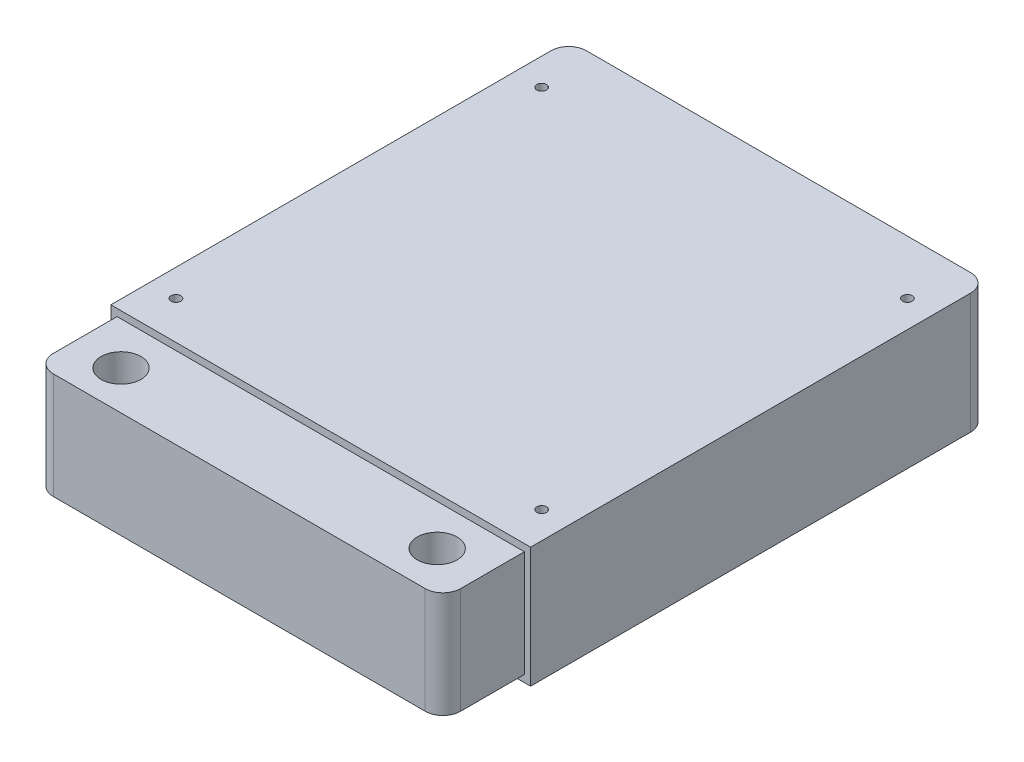
ISO-10303-21;
HEADER;
FILE_DESCRIPTION(('STEP AP214'),'2;1');
FILE_NAME('part.step','',(''),(''),'','','');
FILE_SCHEMA(('AUTOMOTIVE_DESIGN { 1 0 10303 214 1 1 1 1 }'));
ENDSEC;
DATA;
#1=APPLICATION_CONTEXT('core data for automotive mechanical design processes');
#2=APPLICATION_PROTOCOL_DEFINITION('international standard','automotive_design',2000,#1);
#3=PRODUCT_CONTEXT('',#1,'mechanical');
#4=PRODUCT('Part','Part','',(#3));
#5=PRODUCT_RELATED_PRODUCT_CATEGORY('part','',(#4));
#6=PRODUCT_DEFINITION_FORMATION('','',#4);
#7=PRODUCT_DEFINITION_CONTEXT('part definition',#1,'design');
#8=PRODUCT_DEFINITION('design','',#6,#7);
#9=PRODUCT_DEFINITION_SHAPE('','',#8);
#10=(LENGTH_UNIT() NAMED_UNIT(*) SI_UNIT(.MILLI.,.METRE.));
#11=(NAMED_UNIT(*) PLANE_ANGLE_UNIT() SI_UNIT($,.RADIAN.));
#12=(NAMED_UNIT(*) SI_UNIT($,.STERADIAN.) SOLID_ANGLE_UNIT());
#13=UNCERTAINTY_MEASURE_WITH_UNIT(LENGTH_MEASURE(1.E-05),#10,'distance_accuracy_value','');
#14=(GEOMETRIC_REPRESENTATION_CONTEXT(3) GLOBAL_UNCERTAINTY_ASSIGNED_CONTEXT((#13)) GLOBAL_UNIT_ASSIGNED_CONTEXT((#10,
#11,#12)) REPRESENTATION_CONTEXT('',''));
#15=CARTESIAN_POINT('',(0.,0.,0.));
#16=DIRECTION('',(0.,0.,1.));
#17=DIRECTION('',(1.,0.,0.));
#18=AXIS2_PLACEMENT_3D('',#15,#16,#17);
#19=CARTESIAN_POINT('',(-143.433647385571,34.544,12.0931673151752));
#20=DIRECTION('',(0.,0.,-1.));
#21=DIRECTION('',(-1.,0.,0.));
#22=AXIS2_PLACEMENT_3D('',#19,#20,#21);
#23=PLANE('',#22);
#24=DIRECTION('',(1.,0.,0.));
#25=VECTOR('',#24,1.);
#26=CARTESIAN_POINT('',(-143.433647385571,0.,12.0931673151752));
#27=LINE('',#26,#25);
#28=CARTESIAN_POINT('',(-143.433647385571,0.,12.0931673151752));
#29=VERTEX_POINT('',#28);
#30=CARTESIAN_POINT('',(-23.0376473855714,0.,12.0931673151752));
#31=VERTEX_POINT('',#30);
#32=EDGE_CURVE('E186',#29,#31,#27,.T.);
#33=ORIENTED_EDGE('',*,*,#32,.T.);
#34=DIRECTION('',(0.,-1.,0.));
#35=VECTOR('',#34,1.);
#36=CARTESIAN_POINT('',(-23.0376473855714,34.544,12.0931673151752));
#37=LINE('',#36,#35);
#38=CARTESIAN_POINT('',(-23.0376473855714,34.544,12.0931673151752));
#39=VERTEX_POINT('',#38);
#40=EDGE_CURVE('E193',#39,#31,#37,.T.);
#41=ORIENTED_EDGE('',*,*,#40,.F.);
#42=DIRECTION('',(1.,0.,0.));
#43=VECTOR('',#42,1.);
#44=CARTESIAN_POINT('',(-143.433647385571,34.544,12.0931673151752));
#45=LINE('',#44,#43);
#46=CARTESIAN_POINT('',(-143.433647385571,34.544,12.0931673151752));
#47=VERTEX_POINT('',#46);
#48=EDGE_CURVE('E191',#47,#39,#45,.T.);
#49=ORIENTED_EDGE('',*,*,#48,.F.);
#50=DIRECTION('',(0.,-1.,0.));
#51=VECTOR('',#50,1.);
#52=CARTESIAN_POINT('',(-143.433647385571,34.544,12.0931673151752));
#53=LINE('',#52,#51);
#54=EDGE_CURVE('E204',#47,#29,#53,.T.);
#55=ORIENTED_EDGE('',*,*,#54,.T.);
#56=EDGE_LOOP('',(#33,#41,#49,#55));
#57=FACE_BOUND('',#56,.T.);
#58=DIRECTION('',(0.,1.,0.));
#59=VECTOR('',#58,1.);
#60=CARTESIAN_POINT('',(-24.8156473855714,2.032,12.0931673151752));
#61=LINE('',#60,#59);
#62=CARTESIAN_POINT('',(-24.8156473855714,2.032,12.0931673151752));
#63=VERTEX_POINT('',#62);
#64=CARTESIAN_POINT('',(-24.8156473855714,32.512,12.0931673151752));
#65=VERTEX_POINT('',#64);
#66=EDGE_CURVE('E124',#63,#65,#61,.T.);
#67=ORIENTED_EDGE('',*,*,#66,.F.);
#68=DIRECTION('',(1.,0.,0.));
#69=VECTOR('',#68,1.);
#70=CARTESIAN_POINT('',(-141.655647385571,2.032,12.0931673151752));
#71=LINE('',#70,#69);
#72=CARTESIAN_POINT('',(-141.655647385571,2.032,12.0931673151752));
#73=VERTEX_POINT('',#72);
#74=EDGE_CURVE('E136',#73,#63,#71,.T.);
#75=ORIENTED_EDGE('',*,*,#74,.F.);
#76=DIRECTION('',(0.,-1.,0.));
#77=VECTOR('',#76,1.);
#78=CARTESIAN_POINT('',(-141.655647385571,2.032,12.0931673151752));
#79=LINE('',#78,#77);
#80=CARTESIAN_POINT('',(-141.655647385571,32.512,12.0931673151752));
#81=VERTEX_POINT('',#80);
#82=EDGE_CURVE('E145',#81,#73,#79,.T.);
#83=ORIENTED_EDGE('',*,*,#82,.F.);
#84=DIRECTION('',(-1.,0.,0.));
#85=VECTOR('',#84,1.);
#86=CARTESIAN_POINT('',(-141.655647385571,32.512,12.0931673151752));
#87=LINE('',#86,#85);
#88=EDGE_CURVE('E139',#65,#81,#87,.T.);
#89=ORIENTED_EDGE('',*,*,#88,.F.);
#90=EDGE_LOOP('',(#67,#75,#83,#89));
#91=FACE_BOUND('',#90,.T.);
#92=ADVANCED_FACE('F32',(#57,#91),#23,.F.);
#93=CARTESIAN_POINT('',(-23.0376473855714,34.544,-119.224832684825));
#94=DIRECTION('',(-1.,0.,0.));
#95=DIRECTION('',(0.,0.,1.));
#96=AXIS2_PLACEMENT_3D('',#93,#94,#95);
#97=PLANE('',#96);
#98=DIRECTION('',(0.,0.,-1.));
#99=VECTOR('',#98,1.);
#100=CARTESIAN_POINT('',(-23.0376473855714,0.,-119.224832684825));
#101=LINE('',#100,#99);
#102=CARTESIAN_POINT('',(-23.0376473855714,0.,-114.144832684825));
#103=VERTEX_POINT('',#102);
#104=EDGE_CURVE('E179',#31,#103,#101,.T.);
#105=ORIENTED_EDGE('',*,*,#104,.T.);
#106=DIRECTION('',(0.,-1.,0.));
#107=VECTOR('',#106,1.);
#108=CARTESIAN_POINT('',(-23.0376473855714,34.544,-114.144832684825));
#109=LINE('',#108,#107);
#110=CARTESIAN_POINT('',(-23.0376473855714,34.544,-114.144832684825));
#111=VERTEX_POINT('',#110);
#112=EDGE_CURVE('E223',#103,#111,#109,.F.);
#113=ORIENTED_EDGE('',*,*,#112,.T.);
#114=DIRECTION('',(0.,0.,-1.));
#115=VECTOR('',#114,1.);
#116=CARTESIAN_POINT('',(-23.0376473855714,34.544,-119.224832684825));
#117=LINE('',#116,#115);
#118=EDGE_CURVE('E182',#39,#111,#117,.T.);
#119=ORIENTED_EDGE('',*,*,#118,.F.);
#120=ORIENTED_EDGE('',*,*,#40,.T.);
#121=EDGE_LOOP('',(#105,#113,#119,#120));
#122=FACE_BOUND('',#121,.T.);
#123=ADVANCED_FACE('F284',(#122),#97,.F.);
#124=CARTESIAN_POINT('',(-143.433647385571,34.544,-119.224832684825));
#125=DIRECTION('',(0.,0.,1.));
#126=DIRECTION('',(1.,0.,0.));
#127=AXIS2_PLACEMENT_3D('',#124,#125,#126);
#128=PLANE('',#127);
#129=DIRECTION('',(-1.,0.,0.));
#130=VECTOR('',#129,1.);
#131=CARTESIAN_POINT('',(-143.433647385571,34.544,-119.224832684825));
#132=LINE('',#131,#130);
#133=CARTESIAN_POINT('',(-28.1176473855715,34.544,-119.224832684825));
#134=VERTEX_POINT('',#133);
#135=CARTESIAN_POINT('',(-138.353647385571,34.544,-119.224832684825));
#136=VERTEX_POINT('',#135);
#137=EDGE_CURVE('E185',#134,#136,#132,.T.);
#138=ORIENTED_EDGE('',*,*,#137,.F.);
#139=DIRECTION('',(0.,-1.,0.));
#140=VECTOR('',#139,1.);
#141=CARTESIAN_POINT('',(-28.1176473855714,34.544,-119.224832684825));
#142=LINE('',#141,#140);
#143=CARTESIAN_POINT('',(-28.1176473855715,0.,-119.224832684825));
#144=VERTEX_POINT('',#143);
#145=EDGE_CURVE('E216',#134,#144,#142,.T.);
#146=ORIENTED_EDGE('',*,*,#145,.T.);
#147=DIRECTION('',(-1.,0.,0.));
#148=VECTOR('',#147,1.);
#149=CARTESIAN_POINT('',(-143.433647385571,0.,-119.224832684825));
#150=LINE('',#149,#148);
#151=CARTESIAN_POINT('',(-138.353647385571,0.,-119.224832684825));
#152=VERTEX_POINT('',#151);
#153=EDGE_CURVE('E196',#144,#152,#150,.T.);
#154=ORIENTED_EDGE('',*,*,#153,.T.);
#155=DIRECTION('',(0.,-1.,0.));
#156=VECTOR('',#155,1.);
#157=CARTESIAN_POINT('',(-138.353647385571,34.544,-119.224832684825));
#158=LINE('',#157,#156);
#159=EDGE_CURVE('E207',#152,#136,#158,.F.);
#160=ORIENTED_EDGE('',*,*,#159,.T.);
#161=EDGE_LOOP('',(#138,#146,#154,#160));
#162=FACE_BOUND('',#161,.T.);
#163=ADVANCED_FACE('F290',(#162),#128,.F.);
#164=CARTESIAN_POINT('',(-143.433647385571,34.544,-119.224832684825));
#165=DIRECTION('',(1.,0.,0.));
#166=DIRECTION('',(0.,0.,-1.));
#167=AXIS2_PLACEMENT_3D('',#164,#165,#166);
#168=PLANE('',#167);
#169=DIRECTION('',(0.,0.,1.));
#170=VECTOR('',#169,1.);
#171=CARTESIAN_POINT('',(-143.433647385571,34.544,-119.224832684825));
#172=LINE('',#171,#170);
#173=CARTESIAN_POINT('',(-143.433647385571,34.544,-114.144832684825));
#174=VERTEX_POINT('',#173);
#175=EDGE_CURVE('E189',#174,#47,#172,.T.);
#176=ORIENTED_EDGE('',*,*,#175,.F.);
#177=DIRECTION('',(0.,-1.,0.));
#178=VECTOR('',#177,1.);
#179=CARTESIAN_POINT('',(-143.433647385571,34.544,-114.144832684825));
#180=LINE('',#179,#178);
#181=CARTESIAN_POINT('',(-143.433647385571,0.,-114.144832684825));
#182=VERTEX_POINT('',#181);
#183=EDGE_CURVE('E229',#174,#182,#180,.T.);
#184=ORIENTED_EDGE('',*,*,#183,.T.);
#185=DIRECTION('',(0.,0.,1.));
#186=VECTOR('',#185,1.);
#187=CARTESIAN_POINT('',(-143.433647385571,0.,-119.224832684825));
#188=LINE('',#187,#186);
#189=EDGE_CURVE('E199',#182,#29,#188,.T.);
#190=ORIENTED_EDGE('',*,*,#189,.T.);
#191=ORIENTED_EDGE('',*,*,#54,.F.);
#192=EDGE_LOOP('',(#176,#184,#190,#191));
#193=FACE_BOUND('',#192,.T.);
#194=ADVANCED_FACE('F297',(#193),#168,.F.);
#195=CARTESIAN_POINT('',(0.,34.544,0.));
#196=DIRECTION('',(0.,1.,0.));
#197=DIRECTION('',(0.,0.,1.));
#198=AXIS2_PLACEMENT_3D('',#195,#196,#197);
#199=PLANE('',#198);
#200=CARTESIAN_POINT('',(-30.7846473855714,34.544,-103.730832684825));
#201=DIRECTION('',(0.,1.,0.));
#202=DIRECTION('',(0.,0.,1.));
#203=AXIS2_PLACEMENT_3D('',#200,#201,#202);
#204=CIRCLE('',#203,1.397);
#205=CARTESIAN_POINT('',(-30.7846473855714,34.544,-102.333832684825));
#206=VERTEX_POINT('',#205);
#207=EDGE_CURVE('E162',#206,#206,#204,.T.);
#208=ORIENTED_EDGE('',*,*,#207,.F.);
#209=EDGE_LOOP('',(#208));
#210=FACE_BOUND('',#209,.T.);
#211=CARTESIAN_POINT('',(-135.686647385571,34.544,1.17116731517515));
#212=DIRECTION('',(0.,1.,0.));
#213=DIRECTION('',(0.,0.,1.));
#214=AXIS2_PLACEMENT_3D('',#211,#212,#213);
#215=CIRCLE('',#214,1.39700000000002);
#216=CARTESIAN_POINT('',(-135.686647385571,34.544,2.56816731517517));
#217=VERTEX_POINT('',#216);
#218=EDGE_CURVE('E168',#217,#217,#215,.T.);
#219=ORIENTED_EDGE('',*,*,#218,.F.);
#220=EDGE_LOOP('',(#219));
#221=FACE_BOUND('',#220,.T.);
#222=CARTESIAN_POINT('',(-30.7846473855714,34.544,1.17116731517515));
#223=DIRECTION('',(0.,1.,0.));
#224=DIRECTION('',(0.,0.,1.));
#225=AXIS2_PLACEMENT_3D('',#222,#223,#224);
#226=CIRCLE('',#225,1.397);
#227=CARTESIAN_POINT('',(-30.7846473855714,34.544,2.56816731517515));
#228=VERTEX_POINT('',#227);
#229=EDGE_CURVE('E157',#228,#228,#226,.T.);
#230=ORIENTED_EDGE('',*,*,#229,.F.);
#231=EDGE_LOOP('',(#230));
#232=FACE_BOUND('',#231,.T.);
#233=CARTESIAN_POINT('',(-135.686647385571,34.544,-103.730832684825));
#234=DIRECTION('',(0.,1.,0.));
#235=DIRECTION('',(0.,0.,1.));
#236=AXIS2_PLACEMENT_3D('',#233,#234,#235);
#237=CIRCLE('',#236,1.39700000000002);
#238=CARTESIAN_POINT('',(-135.686647385571,34.544,-102.333832684825));
#239=VERTEX_POINT('',#238);
#240=EDGE_CURVE('E161',#239,#239,#237,.T.);
#241=ORIENTED_EDGE('',*,*,#240,.F.);
#242=EDGE_LOOP('',(#241));
#243=FACE_BOUND('',#242,.T.);
#244=ORIENTED_EDGE('',*,*,#118,.T.);
#245=CARTESIAN_POINT('',(-28.1176473855714,34.544,-114.144832684825));
#246=DIRECTION('',(0.,1.,0.));
#247=DIRECTION('',(0.,0.,1.));
#248=AXIS2_PLACEMENT_3D('',#245,#246,#247);
#249=CIRCLE('',#248,5.08);
#250=EDGE_CURVE('E227',#111,#134,#249,.T.);
#251=ORIENTED_EDGE('',*,*,#250,.T.);
#252=ORIENTED_EDGE('',*,*,#137,.T.);
#253=CARTESIAN_POINT('',(-138.353647385571,34.544,-114.144832684825));
#254=DIRECTION('',(0.,1.,0.));
#255=DIRECTION('',(0.,0.,1.));
#256=AXIS2_PLACEMENT_3D('',#253,#254,#255);
#257=CIRCLE('',#256,5.08);
#258=EDGE_CURVE('E225',#136,#174,#257,.T.);
#259=ORIENTED_EDGE('',*,*,#258,.T.);
#260=ORIENTED_EDGE('',*,*,#175,.T.);
#261=ORIENTED_EDGE('',*,*,#48,.T.);
#262=EDGE_LOOP('',(#244,#251,#252,#259,#260,#261));
#263=FACE_BOUND('',#262,.T.);
#264=ADVANCED_FACE('F300',(#210,#221,#232,#243,#263),#199,.T.);
#265=CARTESIAN_POINT('',(0.,0.,0.));
#266=DIRECTION('',(0.,1.,0.));
#267=DIRECTION('',(0.,0.,1.));
#268=AXIS2_PLACEMENT_3D('',#265,#266,#267);
#269=PLANE('',#268);
#270=CARTESIAN_POINT('',(-30.7846473855714,0.,-103.730832684825));
#271=DIRECTION('',(0.,1.,0.));
#272=DIRECTION('',(0.,0.,1.));
#273=AXIS2_PLACEMENT_3D('',#270,#271,#272);
#274=CIRCLE('',#273,1.397);
#275=CARTESIAN_POINT('',(-30.7846473855714,0.,-102.333832684825));
#276=VERTEX_POINT('',#275);
#277=EDGE_CURVE('E158',#276,#276,#274,.T.);
#278=ORIENTED_EDGE('',*,*,#277,.T.);
#279=EDGE_LOOP('',(#278));
#280=FACE_BOUND('',#279,.T.);
#281=CARTESIAN_POINT('',(-135.686647385571,0.,1.17116731517515));
#282=DIRECTION('',(0.,1.,0.));
#283=DIRECTION('',(0.,0.,1.));
#284=AXIS2_PLACEMENT_3D('',#281,#282,#283);
#285=CIRCLE('',#284,1.39700000000002);
#286=CARTESIAN_POINT('',(-135.686647385571,0.,2.56816731517517));
#287=VERTEX_POINT('',#286);
#288=EDGE_CURVE('E165',#287,#287,#285,.T.);
#289=ORIENTED_EDGE('',*,*,#288,.T.);
#290=EDGE_LOOP('',(#289));
#291=FACE_BOUND('',#290,.T.);
#292=CARTESIAN_POINT('',(-30.7846473855714,0.,1.17116731517515));
#293=DIRECTION('',(0.,1.,0.));
#294=DIRECTION('',(0.,0.,1.));
#295=AXIS2_PLACEMENT_3D('',#292,#293,#294);
#296=CIRCLE('',#295,1.397);
#297=CARTESIAN_POINT('',(-30.7846473855714,0.,2.56816731517515));
#298=VERTEX_POINT('',#297);
#299=EDGE_CURVE('E171',#298,#298,#296,.T.);
#300=ORIENTED_EDGE('',*,*,#299,.T.);
#301=EDGE_LOOP('',(#300));
#302=FACE_BOUND('',#301,.T.);
#303=CARTESIAN_POINT('',(-135.686647385571,0.,-103.730832684825));
#304=DIRECTION('',(0.,1.,0.));
#305=DIRECTION('',(0.,0.,1.));
#306=AXIS2_PLACEMENT_3D('',#303,#304,#305);
#307=CIRCLE('',#306,1.39700000000002);
#308=CARTESIAN_POINT('',(-135.686647385571,0.,-102.333832684825));
#309=VERTEX_POINT('',#308);
#310=EDGE_CURVE('E176',#309,#309,#307,.T.);
#311=ORIENTED_EDGE('',*,*,#310,.T.);
#312=EDGE_LOOP('',(#311));
#313=FACE_BOUND('',#312,.T.);
#314=ORIENTED_EDGE('',*,*,#153,.F.);
#315=CARTESIAN_POINT('',(-28.1176473855714,0.,-114.144832684825));
#316=DIRECTION('',(0.,1.,0.));
#317=DIRECTION('',(0.,0.,1.));
#318=AXIS2_PLACEMENT_3D('',#315,#316,#317);
#319=CIRCLE('',#318,5.08);
#320=EDGE_CURVE('E221',#144,#103,#319,.F.);
#321=ORIENTED_EDGE('',*,*,#320,.T.);
#322=ORIENTED_EDGE('',*,*,#104,.F.);
#323=ORIENTED_EDGE('',*,*,#32,.F.);
#324=ORIENTED_EDGE('',*,*,#189,.F.);
#325=CARTESIAN_POINT('',(-138.353647385571,0.,-114.144832684825));
#326=DIRECTION('',(0.,1.,0.));
#327=DIRECTION('',(0.,0.,1.));
#328=AXIS2_PLACEMENT_3D('',#325,#326,#327);
#329=CIRCLE('',#328,5.08);
#330=EDGE_CURVE('E219',#182,#152,#329,.F.);
#331=ORIENTED_EDGE('',*,*,#330,.T.);
#332=EDGE_LOOP('',(#314,#321,#322,#323,#324,#331));
#333=FACE_BOUND('',#332,.T.);
#334=ADVANCED_FACE('F295',(#280,#291,#302,#313,#333),#269,.F.);
#335=CARTESIAN_POINT('',(-135.686647385571,0.,-103.730832684825));
#336=DIRECTION('',(0.,1.,0.));
#337=DIRECTION('',(0.,0.,1.));
#338=AXIS2_PLACEMENT_3D('',#335,#336,#337);
#339=CYLINDRICAL_SURFACE('',#338,1.39700000000002);
#340=ORIENTED_EDGE('',*,*,#310,.F.);
#341=EDGE_LOOP('',(#340));
#342=FACE_BOUND('',#341,.T.);
#343=ORIENTED_EDGE('',*,*,#240,.T.);
#344=EDGE_LOOP('',(#343));
#345=FACE_BOUND('',#344,.T.);
#346=ADVANCED_FACE('F380',(#342,#345),#339,.F.);
#347=CARTESIAN_POINT('',(-30.7846473855714,0.,1.17116731517515));
#348=DIRECTION('',(0.,1.,0.));
#349=DIRECTION('',(0.,0.,1.));
#350=AXIS2_PLACEMENT_3D('',#347,#348,#349);
#351=CYLINDRICAL_SURFACE('',#350,1.397);
#352=ORIENTED_EDGE('',*,*,#299,.F.);
#353=EDGE_LOOP('',(#352));
#354=FACE_BOUND('',#353,.T.);
#355=ORIENTED_EDGE('',*,*,#229,.T.);
#356=EDGE_LOOP('',(#355));
#357=FACE_BOUND('',#356,.T.);
#358=ADVANCED_FACE('F440',(#354,#357),#351,.F.);
#359=CARTESIAN_POINT('',(-135.686647385571,0.,1.17116731517515));
#360=DIRECTION('',(0.,1.,0.));
#361=DIRECTION('',(0.,0.,1.));
#362=AXIS2_PLACEMENT_3D('',#359,#360,#361);
#363=CYLINDRICAL_SURFACE('',#362,1.39700000000002);
#364=ORIENTED_EDGE('',*,*,#288,.F.);
#365=EDGE_LOOP('',(#364));
#366=FACE_BOUND('',#365,.T.);
#367=ORIENTED_EDGE('',*,*,#218,.T.);
#368=EDGE_LOOP('',(#367));
#369=FACE_BOUND('',#368,.T.);
#370=ADVANCED_FACE('F430',(#366,#369),#363,.F.);
#371=CARTESIAN_POINT('',(-30.7846473855714,0.,-103.730832684825));
#372=DIRECTION('',(0.,1.,0.));
#373=DIRECTION('',(0.,0.,1.));
#374=AXIS2_PLACEMENT_3D('',#371,#372,#373);
#375=CYLINDRICAL_SURFACE('',#374,1.397);
#376=ORIENTED_EDGE('',*,*,#277,.F.);
#377=EDGE_LOOP('',(#376));
#378=FACE_BOUND('',#377,.T.);
#379=ORIENTED_EDGE('',*,*,#207,.T.);
#380=EDGE_LOOP('',(#379));
#381=FACE_BOUND('',#380,.T.);
#382=ADVANCED_FACE('F369',(#378,#381),#375,.F.);
#383=CARTESIAN_POINT('',(-24.8156473855714,2.032,35.4611673151752));
#384=DIRECTION('',(-1.,0.,0.));
#385=DIRECTION('',(0.,0.,1.));
#386=AXIS2_PLACEMENT_3D('',#383,#384,#385);
#387=PLANE('',#386);
#388=DIRECTION('',(0.,0.,-1.));
#389=VECTOR('',#388,1.);
#390=CARTESIAN_POINT('',(-24.8156473855714,32.512,35.4611673151752));
#391=LINE('',#390,#389);
#392=CARTESIAN_POINT('',(-24.8156473855714,32.512,30.3811673151752));
#393=VERTEX_POINT('',#392);
#394=EDGE_CURVE('E155',#393,#65,#391,.T.);
#395=ORIENTED_EDGE('',*,*,#394,.F.);
#396=DIRECTION('',(0.,1.,0.));
#397=VECTOR('',#396,1.);
#398=CARTESIAN_POINT('',(-24.8156473855714,2.032,30.3811673151752));
#399=LINE('',#398,#397);
#400=CARTESIAN_POINT('',(-24.8156473855714,2.032,30.3811673151752));
#401=VERTEX_POINT('',#400);
#402=EDGE_CURVE('E11',#393,#401,#399,.F.);
#403=ORIENTED_EDGE('',*,*,#402,.T.);
#404=DIRECTION('',(0.,0.,-1.));
#405=VECTOR('',#404,1.);
#406=CARTESIAN_POINT('',(-24.8156473855714,2.032,35.4611673151752));
#407=LINE('',#406,#405);
#408=EDGE_CURVE('E121',#401,#63,#407,.T.);
#409=ORIENTED_EDGE('',*,*,#408,.T.);
#410=ORIENTED_EDGE('',*,*,#66,.T.);
#411=EDGE_LOOP('',(#395,#403,#409,#410));
#412=FACE_BOUND('',#411,.T.);
#413=ADVANCED_FACE('F123',(#412),#387,.F.);
#414=CARTESIAN_POINT('',(-141.655647385571,32.512,35.4611673151752));
#415=DIRECTION('',(0.,-1.,0.));
#416=DIRECTION('',(0.,0.,-1.));
#417=AXIS2_PLACEMENT_3D('',#414,#415,#416);
#418=PLANE('',#417);
#419=CARTESIAN_POINT('',(-38.1506473855714,32.512,23.7771673151752));
#420=DIRECTION('',(0.,1.,0.));
#421=DIRECTION('',(0.,0.,1.));
#422=AXIS2_PLACEMENT_3D('',#419,#420,#421);
#423=CIRCLE('',#422,5.715);
#424=CARTESIAN_POINT('',(-38.1506473855714,32.512,29.4921673151751));
#425=VERTEX_POINT('',#424);
#426=EDGE_CURVE('E214',#425,#425,#423,.T.);
#427=ORIENTED_EDGE('',*,*,#426,.F.);
#428=EDGE_LOOP('',(#427));
#429=FACE_BOUND('',#428,.T.);
#430=CARTESIAN_POINT('',(-128.320647385571,32.512,24.2881986543503));
#431=DIRECTION('',(0.,1.,0.));
#432=DIRECTION('',(0.,0.,1.));
#433=AXIS2_PLACEMENT_3D('',#430,#431,#432);
#434=CIRCLE('',#433,5.71499999999999);
#435=CARTESIAN_POINT('',(-128.320647385571,32.512,30.0031986543503));
#436=VERTEX_POINT('',#435);
#437=EDGE_CURVE('E210',#436,#436,#434,.T.);
#438=ORIENTED_EDGE('',*,*,#437,.F.);
#439=EDGE_LOOP('',(#438));
#440=FACE_BOUND('',#439,.T.);
#441=DIRECTION('',(0.,0.,-1.));
#442=VECTOR('',#441,1.);
#443=CARTESIAN_POINT('',(-141.655647385571,32.512,35.4611673151752));
#444=LINE('',#443,#442);
#445=CARTESIAN_POINT('',(-141.655647385571,32.512,30.3811673151752));
#446=VERTEX_POINT('',#445);
#447=EDGE_CURVE('E153',#446,#81,#444,.T.);
#448=ORIENTED_EDGE('',*,*,#447,.F.);
#449=CARTESIAN_POINT('',(-136.575647385571,32.512,30.3811673151752));
#450=DIRECTION('',(0.,-1.,0.));
#451=DIRECTION('',(0.,0.,-1.));
#452=AXIS2_PLACEMENT_3D('',#449,#450,#451);
#453=CIRCLE('',#452,5.08);
#454=CARTESIAN_POINT('',(-136.575647385571,32.512,35.4611673151752));
#455=VERTEX_POINT('',#454);
#456=EDGE_CURVE('E40',#446,#455,#453,.F.);
#457=ORIENTED_EDGE('',*,*,#456,.T.);
#458=DIRECTION('',(-1.,0.,0.));
#459=VECTOR('',#458,1.);
#460=CARTESIAN_POINT('',(-141.655647385571,32.512,35.4611673151752));
#461=LINE('',#460,#459);
#462=CARTESIAN_POINT('',(-29.8956473855714,32.512,35.4611673151752));
#463=VERTEX_POINT('',#462);
#464=EDGE_CURVE('E144',#463,#455,#461,.T.);
#465=ORIENTED_EDGE('',*,*,#464,.F.);
#466=CARTESIAN_POINT('',(-29.8956473855714,32.512,30.3811673151752));
#467=DIRECTION('',(0.,-1.,0.));
#468=DIRECTION('',(0.,0.,-1.));
#469=AXIS2_PLACEMENT_3D('',#466,#467,#468);
#470=CIRCLE('',#469,5.08);
#471=EDGE_CURVE('E47',#463,#393,#470,.F.);
#472=ORIENTED_EDGE('',*,*,#471,.T.);
#473=ORIENTED_EDGE('',*,*,#394,.T.);
#474=ORIENTED_EDGE('',*,*,#88,.T.);
#475=EDGE_LOOP('',(#448,#457,#465,#472,#473,#474));
#476=FACE_BOUND('',#475,.T.);
#477=ADVANCED_FACE('F244',(#429,#440,#476),#418,.F.);
#478=CARTESIAN_POINT('',(-141.655647385571,2.032,35.4611673151752));
#479=DIRECTION('',(1.,0.,0.));
#480=DIRECTION('',(0.,0.,-1.));
#481=AXIS2_PLACEMENT_3D('',#478,#479,#480);
#482=PLANE('',#481);
#483=DIRECTION('',(0.,0.,-1.));
#484=VECTOR('',#483,1.);
#485=CARTESIAN_POINT('',(-141.655647385571,2.032,35.4611673151752));
#486=LINE('',#485,#484);
#487=CARTESIAN_POINT('',(-141.655647385571,2.032,30.3811673151752));
#488=VERTEX_POINT('',#487);
#489=EDGE_CURVE('E129',#488,#73,#486,.T.);
#490=ORIENTED_EDGE('',*,*,#489,.F.);
#491=DIRECTION('',(0.,-1.,0.));
#492=VECTOR('',#491,1.);
#493=CARTESIAN_POINT('',(-141.655647385571,2.032,30.3811673151752));
#494=LINE('',#493,#492);
#495=EDGE_CURVE('E55',#488,#446,#494,.F.);
#496=ORIENTED_EDGE('',*,*,#495,.T.);
#497=ORIENTED_EDGE('',*,*,#447,.T.);
#498=ORIENTED_EDGE('',*,*,#82,.T.);
#499=EDGE_LOOP('',(#490,#496,#497,#498));
#500=FACE_BOUND('',#499,.T.);
#501=ADVANCED_FACE('F252',(#500),#482,.F.);
#502=CARTESIAN_POINT('',(-141.655647385571,2.032,35.4611673151752));
#503=DIRECTION('',(0.,1.,0.));
#504=DIRECTION('',(0.,0.,1.));
#505=AXIS2_PLACEMENT_3D('',#502,#503,#504);
#506=PLANE('',#505);
#507=CARTESIAN_POINT('',(-38.1506473855714,2.032,23.7771673151752));
#508=DIRECTION('',(0.,1.,0.));
#509=DIRECTION('',(0.,0.,1.));
#510=AXIS2_PLACEMENT_3D('',#507,#508,#509);
#511=CIRCLE('',#510,5.715);
#512=CARTESIAN_POINT('',(-38.1506473855714,2.032,29.4921673151751));
#513=VERTEX_POINT('',#512);
#514=EDGE_CURVE('E211',#513,#513,#511,.T.);
#515=ORIENTED_EDGE('',*,*,#514,.T.);
#516=EDGE_LOOP('',(#515));
#517=FACE_BOUND('',#516,.T.);
#518=CARTESIAN_POINT('',(-128.320647385571,2.032,24.2881986543503));
#519=DIRECTION('',(0.,1.,0.));
#520=DIRECTION('',(0.,0.,1.));
#521=AXIS2_PLACEMENT_3D('',#518,#519,#520);
#522=CIRCLE('',#521,5.71499999999999);
#523=CARTESIAN_POINT('',(-128.320647385571,2.032,30.0031986543503));
#524=VERTEX_POINT('',#523);
#525=EDGE_CURVE('E140',#524,#524,#522,.T.);
#526=ORIENTED_EDGE('',*,*,#525,.T.);
#527=EDGE_LOOP('',(#526));
#528=FACE_BOUND('',#527,.T.);
#529=DIRECTION('',(1.,0.,0.));
#530=VECTOR('',#529,1.);
#531=CARTESIAN_POINT('',(-141.655647385571,2.032,35.4611673151752));
#532=LINE('',#531,#530);
#533=CARTESIAN_POINT('',(-136.575647385571,2.032,35.4611673151752));
#534=VERTEX_POINT('',#533);
#535=CARTESIAN_POINT('',(-29.8956473855714,2.032,35.4611673151752));
#536=VERTEX_POINT('',#535);
#537=EDGE_CURVE('E130',#534,#536,#532,.T.);
#538=ORIENTED_EDGE('',*,*,#537,.F.);
#539=CARTESIAN_POINT('',(-136.575647385571,2.032,30.3811673151752));
#540=DIRECTION('',(0.,1.,0.));
#541=DIRECTION('',(0.,0.,1.));
#542=AXIS2_PLACEMENT_3D('',#539,#540,#541);
#543=CIRCLE('',#542,5.08);
#544=EDGE_CURVE('E240',#534,#488,#543,.F.);
#545=ORIENTED_EDGE('',*,*,#544,.T.);
#546=ORIENTED_EDGE('',*,*,#489,.T.);
#547=ORIENTED_EDGE('',*,*,#74,.T.);
#548=ORIENTED_EDGE('',*,*,#408,.F.);
#549=CARTESIAN_POINT('',(-29.8956473855714,2.032,30.3811673151752));
#550=DIRECTION('',(0.,1.,0.));
#551=DIRECTION('',(0.,0.,1.));
#552=AXIS2_PLACEMENT_3D('',#549,#550,#551);
#553=CIRCLE('',#552,5.08);
#554=EDGE_CURVE('E238',#401,#536,#553,.F.);
#555=ORIENTED_EDGE('',*,*,#554,.T.);
#556=EDGE_LOOP('',(#538,#545,#546,#547,#548,#555));
#557=FACE_BOUND('',#556,.T.);
#558=ADVANCED_FACE('F143',(#517,#528,#557),#506,.F.);
#559=CARTESIAN_POINT('',(0.,0.,35.4611673151752));
#560=DIRECTION('',(0.,0.,-1.));
#561=DIRECTION('',(-1.,0.,0.));
#562=AXIS2_PLACEMENT_3D('',#559,#560,#561);
#563=PLANE('',#562);
#564=ORIENTED_EDGE('',*,*,#464,.T.);
#565=DIRECTION('',(0.,-1.,0.));
#566=VECTOR('',#565,1.);
#567=CARTESIAN_POINT('',(-136.575647385571,0.,35.4611673151752));
#568=LINE('',#567,#566);
#569=EDGE_CURVE('E235',#455,#534,#568,.T.);
#570=ORIENTED_EDGE('',*,*,#569,.T.);
#571=ORIENTED_EDGE('',*,*,#537,.T.);
#572=DIRECTION('',(0.,1.,0.));
#573=VECTOR('',#572,1.);
#574=CARTESIAN_POINT('',(-29.8956473855714,0.,35.4611673151752));
#575=LINE('',#574,#573);
#576=EDGE_CURVE('E232',#536,#463,#575,.T.);
#577=ORIENTED_EDGE('',*,*,#576,.T.);
#578=EDGE_LOOP('',(#564,#570,#571,#577));
#579=FACE_BOUND('',#578,.T.);
#580=ADVANCED_FACE('F248',(#579),#563,.F.);
#581=CARTESIAN_POINT('',(-128.320647385571,0.,24.2881986543503));
#582=DIRECTION('',(0.,1.,0.));
#583=DIRECTION('',(0.,0.,1.));
#584=AXIS2_PLACEMENT_3D('',#581,#582,#583);
#585=CYLINDRICAL_SURFACE('',#584,5.71499999999999);
#586=ORIENTED_EDGE('',*,*,#437,.T.);
#587=EDGE_LOOP('',(#586));
#588=FACE_BOUND('',#587,.T.);
#589=ORIENTED_EDGE('',*,*,#525,.F.);
#590=EDGE_LOOP('',(#589));
#591=FACE_BOUND('',#590,.T.);
#592=ADVANCED_FACE('F268',(#588,#591),#585,.F.);
#593=CARTESIAN_POINT('',(-38.1506473855714,0.,23.7771673151752));
#594=DIRECTION('',(0.,1.,0.));
#595=DIRECTION('',(0.,0.,1.));
#596=AXIS2_PLACEMENT_3D('',#593,#594,#595);
#597=CYLINDRICAL_SURFACE('',#596,5.715);
#598=ORIENTED_EDGE('',*,*,#426,.T.);
#599=EDGE_LOOP('',(#598));
#600=FACE_BOUND('',#599,.T.);
#601=ORIENTED_EDGE('',*,*,#514,.F.);
#602=EDGE_LOOP('',(#601));
#603=FACE_BOUND('',#602,.T.);
#604=ADVANCED_FACE('F260',(#600,#603),#597,.F.);
#605=CARTESIAN_POINT('',(-28.1176473855714,34.544,-114.144832684825));
#606=DIRECTION('',(0.,-1.,0.));
#607=DIRECTION('',(0.,0.,-1.));
#608=AXIS2_PLACEMENT_3D('',#605,#606,#607);
#609=CYLINDRICAL_SURFACE('',#608,5.08);
#610=ORIENTED_EDGE('',*,*,#250,.F.);
#611=ORIENTED_EDGE('',*,*,#112,.F.);
#612=ORIENTED_EDGE('',*,*,#320,.F.);
#613=ORIENTED_EDGE('',*,*,#145,.F.);
#614=EDGE_LOOP('',(#610,#611,#612,#613));
#615=FACE_BOUND('',#614,.T.);
#616=ADVANCED_FACE('F305',(#615),#609,.T.);
#617=CARTESIAN_POINT('',(-138.353647385571,34.544,-114.144832684825));
#618=DIRECTION('',(0.,-1.,0.));
#619=DIRECTION('',(0.,0.,-1.));
#620=AXIS2_PLACEMENT_3D('',#617,#618,#619);
#621=CYLINDRICAL_SURFACE('',#620,5.08);
#622=ORIENTED_EDGE('',*,*,#258,.F.);
#623=ORIENTED_EDGE('',*,*,#159,.F.);
#624=ORIENTED_EDGE('',*,*,#330,.F.);
#625=ORIENTED_EDGE('',*,*,#183,.F.);
#626=EDGE_LOOP('',(#622,#623,#624,#625));
#627=FACE_BOUND('',#626,.T.);
#628=ADVANCED_FACE('F308',(#627),#621,.T.);
#629=CARTESIAN_POINT('',(-136.575647385571,0.,30.3811673151752));
#630=DIRECTION('',(0.,-1.,0.));
#631=DIRECTION('',(0.,0.,-1.));
#632=AXIS2_PLACEMENT_3D('',#629,#630,#631);
#633=CYLINDRICAL_SURFACE('',#632,5.08);
#634=ORIENTED_EDGE('',*,*,#456,.F.);
#635=ORIENTED_EDGE('',*,*,#495,.F.);
#636=ORIENTED_EDGE('',*,*,#544,.F.);
#637=ORIENTED_EDGE('',*,*,#569,.F.);
#638=EDGE_LOOP('',(#634,#635,#636,#637));
#639=FACE_BOUND('',#638,.T.);
#640=ADVANCED_FACE('F251',(#639),#633,.T.);
#641=CARTESIAN_POINT('',(-29.8956473855714,0.,30.3811673151752));
#642=DIRECTION('',(0.,1.,0.));
#643=DIRECTION('',(0.,0.,1.));
#644=AXIS2_PLACEMENT_3D('',#641,#642,#643);
#645=CYLINDRICAL_SURFACE('',#644,5.08);
#646=ORIENTED_EDGE('',*,*,#554,.F.);
#647=ORIENTED_EDGE('',*,*,#402,.F.);
#648=ORIENTED_EDGE('',*,*,#471,.F.);
#649=ORIENTED_EDGE('',*,*,#576,.F.);
#650=EDGE_LOOP('',(#646,#647,#648,#649));
#651=FACE_BOUND('',#650,.T.);
#652=ADVANCED_FACE('F34',(#651),#645,.T.);
#653=CLOSED_SHELL('',(#92,#123,#163,#194,#264,#334,#346,#358,#370,#382,#413,#477,#501,#558,#580,
#592,#604,#616,#628,#640,#652));
#654=MANIFOLD_SOLID_BREP('B2',#653);
#655=ADVANCED_BREP_SHAPE_REPRESENTATION('',(#18,#654),#14);
#656=SHAPE_DEFINITION_REPRESENTATION(#9,#655);
ENDSEC;
END-ISO-10303-21;
